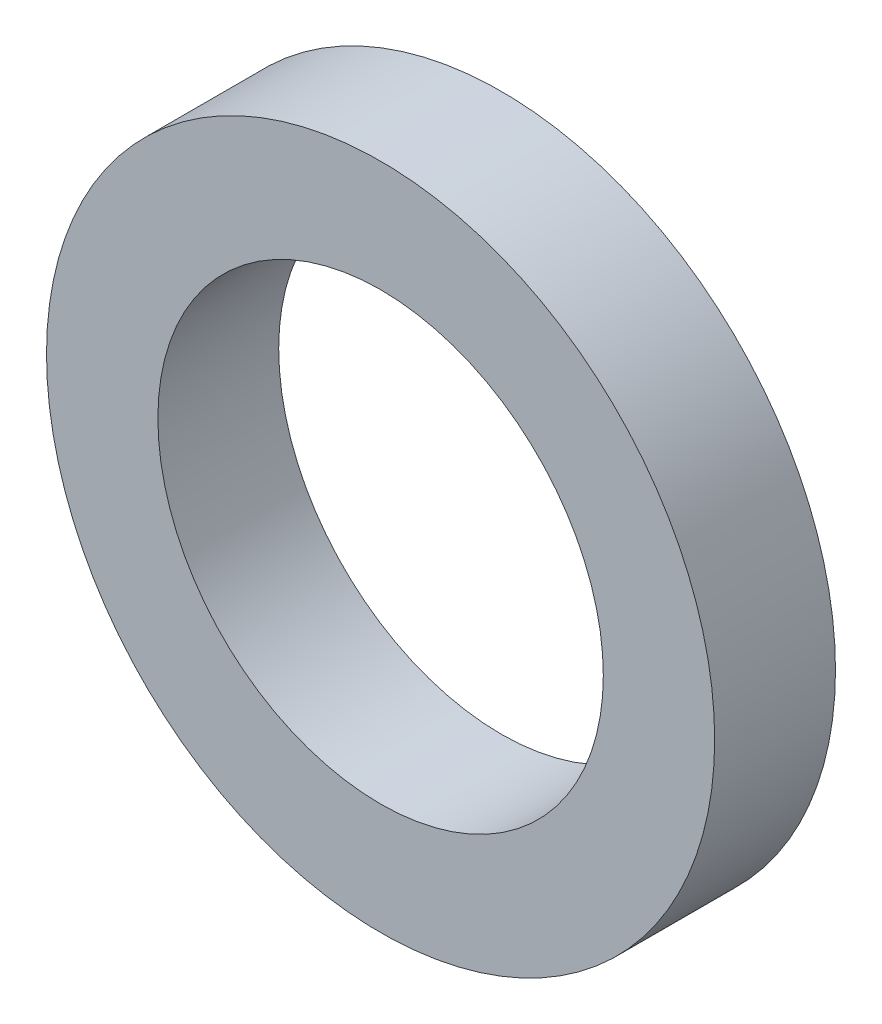
ISO-10303-21;
HEADER;
FILE_DESCRIPTION(('STEP AP214'),'2;1');
FILE_NAME('part.step','',(''),(''),'','','');
FILE_SCHEMA(('AUTOMOTIVE_DESIGN { 1 0 10303 214 1 1 1 1 }'));
ENDSEC;
DATA;
#1=APPLICATION_CONTEXT('core data for automotive mechanical design processes');
#2=APPLICATION_PROTOCOL_DEFINITION('international standard','automotive_design',2000,#1);
#3=PRODUCT_CONTEXT('',#1,'mechanical');
#4=PRODUCT('Part','Part','',(#3));
#5=PRODUCT_RELATED_PRODUCT_CATEGORY('part','',(#4));
#6=PRODUCT_DEFINITION_FORMATION('','',#4);
#7=PRODUCT_DEFINITION_CONTEXT('part definition',#1,'design');
#8=PRODUCT_DEFINITION('design','',#6,#7);
#9=PRODUCT_DEFINITION_SHAPE('','',#8);
#10=(LENGTH_UNIT() NAMED_UNIT(*) SI_UNIT(.MILLI.,.METRE.));
#11=(NAMED_UNIT(*) PLANE_ANGLE_UNIT() SI_UNIT($,.RADIAN.));
#12=(NAMED_UNIT(*) SI_UNIT($,.STERADIAN.) SOLID_ANGLE_UNIT());
#13=UNCERTAINTY_MEASURE_WITH_UNIT(LENGTH_MEASURE(1.E-05),#10,'distance_accuracy_value','');
#14=(GEOMETRIC_REPRESENTATION_CONTEXT(3) GLOBAL_UNCERTAINTY_ASSIGNED_CONTEXT((#13)) GLOBAL_UNIT_ASSIGNED_CONTEXT((#10,
#11,#12)) REPRESENTATION_CONTEXT('',''));
#15=CARTESIAN_POINT('',(0.,0.,0.));
#16=DIRECTION('',(0.,0.,1.));
#17=DIRECTION('',(1.,0.,0.));
#18=AXIS2_PLACEMENT_3D('',#15,#16,#17);
#19=CARTESIAN_POINT('',(0.,76.2,1.3777722));
#20=DIRECTION('',(0.,0.,-1.));
#21=DIRECTION('',(-1.,0.,0.));
#22=AXIS2_PLACEMENT_3D('',#19,#20,#21);
#23=CYLINDRICAL_SURFACE('',#22,2.54);
#24=CARTESIAN_POINT('',(0.,76.2,1.3777722));
#25=DIRECTION('',(0.,0.,1.));
#26=DIRECTION('',(1.,0.,0.));
#27=AXIS2_PLACEMENT_3D('',#24,#25,#26);
#28=CIRCLE('',#27,2.54);
#29=CARTESIAN_POINT('',(2.53999999999999,76.2,1.3777722));
#30=VERTEX_POINT('',#29);
#31=EDGE_CURVE('E22',#30,#30,#28,.T.);
#32=ORIENTED_EDGE('',*,*,#31,.T.);
#33=EDGE_LOOP('',(#32));
#34=FACE_BOUND('',#33,.T.);
#35=CARTESIAN_POINT('',(0.,76.2,0.));
#36=DIRECTION('',(0.,0.,1.));
#37=DIRECTION('',(1.,0.,0.));
#38=AXIS2_PLACEMENT_3D('',#35,#36,#37);
#39=CIRCLE('',#38,2.54);
#40=CARTESIAN_POINT('',(2.53999999999999,76.2,0.));
#41=VERTEX_POINT('',#40);
#42=EDGE_CURVE('E28',#41,#41,#39,.T.);
#43=ORIENTED_EDGE('',*,*,#42,.F.);
#44=EDGE_LOOP('',(#43));
#45=FACE_BOUND('',#44,.T.);
#46=ADVANCED_FACE('F15',(#34,#45),#23,.F.);
#47=CARTESIAN_POINT('',(0.,76.2,1.3777722));
#48=DIRECTION('',(0.,0.,-1.));
#49=DIRECTION('',(-1.,0.,0.));
#50=AXIS2_PLACEMENT_3D('',#47,#48,#49);
#51=CYLINDRICAL_SURFACE('',#50,3.81);
#52=CARTESIAN_POINT('',(0.,76.2,1.3777722));
#53=DIRECTION('',(0.,0.,1.));
#54=DIRECTION('',(1.,0.,0.));
#55=AXIS2_PLACEMENT_3D('',#52,#53,#54);
#56=CIRCLE('',#55,3.81);
#57=CARTESIAN_POINT('',(3.80999999999999,76.2,1.3777722));
#58=VERTEX_POINT('',#57);
#59=EDGE_CURVE('E10',#58,#58,#56,.T.);
#60=ORIENTED_EDGE('',*,*,#59,.F.);
#61=EDGE_LOOP('',(#60));
#62=FACE_BOUND('',#61,.T.);
#63=CARTESIAN_POINT('',(0.,76.2,0.));
#64=DIRECTION('',(0.,0.,1.));
#65=DIRECTION('',(1.,0.,0.));
#66=AXIS2_PLACEMENT_3D('',#63,#64,#65);
#67=CIRCLE('',#66,3.81);
#68=CARTESIAN_POINT('',(3.80999999999999,76.2,0.));
#69=VERTEX_POINT('',#68);
#70=EDGE_CURVE('E18',#69,#69,#67,.T.);
#71=ORIENTED_EDGE('',*,*,#70,.T.);
#72=EDGE_LOOP('',(#71));
#73=FACE_BOUND('',#72,.T.);
#74=ADVANCED_FACE('F35',(#62,#73),#51,.T.);
#75=CARTESIAN_POINT('',(0.,47.625,1.3777722));
#76=DIRECTION('',(0.,0.,1.));
#77=DIRECTION('',(1.,0.,0.));
#78=AXIS2_PLACEMENT_3D('',#75,#76,#77);
#79=PLANE('',#78);
#80=ORIENTED_EDGE('',*,*,#31,.F.);
#81=EDGE_LOOP('',(#80));
#82=FACE_BOUND('',#81,.T.);
#83=ORIENTED_EDGE('',*,*,#59,.T.);
#84=EDGE_LOOP('',(#83));
#85=FACE_BOUND('',#84,.T.);
#86=ADVANCED_FACE('F39',(#82,#85),#79,.T.);
#87=CARTESIAN_POINT('',(0.,47.625,0.));
#88=DIRECTION('',(0.,0.,1.));
#89=DIRECTION('',(1.,0.,0.));
#90=AXIS2_PLACEMENT_3D('',#87,#88,#89);
#91=PLANE('',#90);
#92=ORIENTED_EDGE('',*,*,#42,.T.);
#93=EDGE_LOOP('',(#92));
#94=FACE_BOUND('',#93,.T.);
#95=ORIENTED_EDGE('',*,*,#70,.F.);
#96=EDGE_LOOP('',(#95));
#97=FACE_BOUND('',#96,.T.);
#98=ADVANCED_FACE('F37',(#94,#97),#91,.F.);
#99=CLOSED_SHELL('',(#46,#74,#86,#98));
#100=MANIFOLD_SOLID_BREP('B1',#99);
#101=ADVANCED_BREP_SHAPE_REPRESENTATION('',(#18,#100),#14);
#102=SHAPE_DEFINITION_REPRESENTATION(#9,#101);
ENDSEC;
END-ISO-10303-21;
